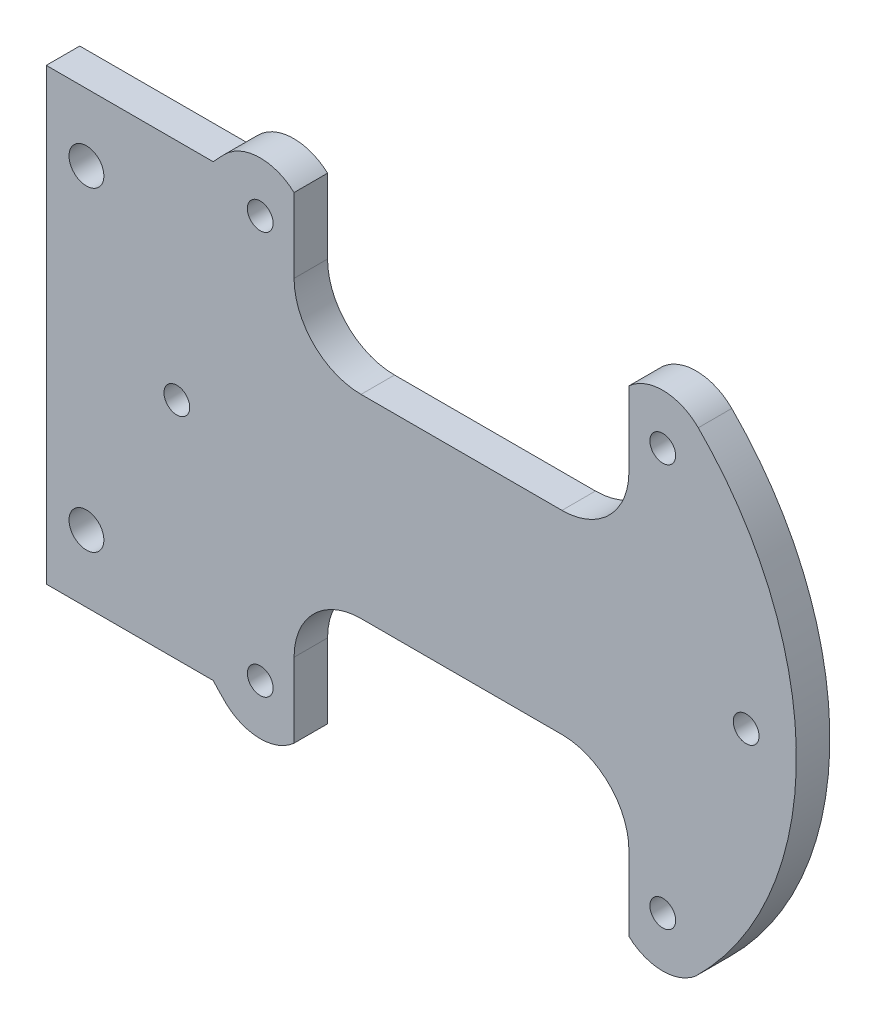
ISO-10303-21;
HEADER;
FILE_DESCRIPTION(('STEP AP214'),'2;1');
FILE_NAME('part.step','',(''),(''),'','','');
FILE_SCHEMA(('AUTOMOTIVE_DESIGN { 1 0 10303 214 1 1 1 1 }'));
ENDSEC;
DATA;
#1=APPLICATION_CONTEXT('core data for automotive mechanical design processes');
#2=APPLICATION_PROTOCOL_DEFINITION('international standard','automotive_design',2000,#1);
#3=PRODUCT_CONTEXT('',#1,'mechanical');
#4=PRODUCT('Part','Part','',(#3));
#5=PRODUCT_RELATED_PRODUCT_CATEGORY('part','',(#4));
#6=PRODUCT_DEFINITION_FORMATION('','',#4);
#7=PRODUCT_DEFINITION_CONTEXT('part definition',#1,'design');
#8=PRODUCT_DEFINITION('design','',#6,#7);
#9=PRODUCT_DEFINITION_SHAPE('','',#8);
#10=(LENGTH_UNIT() NAMED_UNIT(*) SI_UNIT(.MILLI.,.METRE.));
#11=(NAMED_UNIT(*) PLANE_ANGLE_UNIT() SI_UNIT($,.RADIAN.));
#12=(NAMED_UNIT(*) SI_UNIT($,.STERADIAN.) SOLID_ANGLE_UNIT());
#13=UNCERTAINTY_MEASURE_WITH_UNIT(LENGTH_MEASURE(1.E-05),#10,'distance_accuracy_value','');
#14=(GEOMETRIC_REPRESENTATION_CONTEXT(3) GLOBAL_UNCERTAINTY_ASSIGNED_CONTEXT((#13)) GLOBAL_UNIT_ASSIGNED_CONTEXT((#10,
#11,#12)) REPRESENTATION_CONTEXT('',''));
#15=CARTESIAN_POINT('',(0.,0.,0.));
#16=DIRECTION('',(0.,0.,1.));
#17=DIRECTION('',(1.,0.,0.));
#18=AXIS2_PLACEMENT_3D('',#15,#16,#17);
#19=CARTESIAN_POINT('',(0.,0.,-5.));
#20=DIRECTION('',(0.,0.,-1.));
#21=DIRECTION('',(1.,0.,0.));
#22=AXIS2_PLACEMENT_3D('',#19,#20,#21);
#23=PLANE('',#22);
#24=DIRECTION('',(-1.,0.,0.));
#25=VECTOR('',#24,1.);
#26=CARTESIAN_POINT('',(31.1783249397534,-14.7623848374618,-5.));
#27=LINE('',#26,#25);
#28=CARTESIAN_POINT('',(21.1783249397534,-14.7623848374618,-5.));
#29=VERTEX_POINT('',#28);
#30=CARTESIAN_POINT('',(-8.82167506024662,-14.7623848374618,-5.));
#31=VERTEX_POINT('',#30);
#32=EDGE_CURVE('E391',#29,#31,#27,.T.);
#33=ORIENTED_EDGE('',*,*,#32,.T.);
#34=CARTESIAN_POINT('',(-8.82167506024662,-24.7623848374618,-5.));
#35=DIRECTION('',(0.,0.,1.));
#36=DIRECTION('',(1.,0.,0.));
#37=AXIS2_PLACEMENT_3D('',#34,#35,#36);
#38=CIRCLE('',#37,10.);
#39=CARTESIAN_POINT('',(-18.8216750602466,-24.7623848374618,-5.));
#40=VERTEX_POINT('',#39);
#41=EDGE_CURVE('E400',#40,#31,#38,.F.);
#42=ORIENTED_EDGE('',*,*,#41,.F.);
#43=DIRECTION('',(0.,-1.,0.));
#44=VECTOR('',#43,1.);
#45=CARTESIAN_POINT('',(-18.8216750602466,0.,-5.));
#46=LINE('',#45,#44);
#47=CARTESIAN_POINT('',(-18.8216750602466,-35.8766663826548,-5.));
#48=VERTEX_POINT('',#47);
#49=EDGE_CURVE('E310',#40,#48,#46,.T.);
#50=ORIENTED_EDGE('',*,*,#49,.T.);
#51=CARTESIAN_POINT('',(-23.8737132606749,-30.3195256100583,-5.));
#52=DIRECTION('',(0.,0.,1.));
#53=DIRECTION('',(1.,0.,0.));
#54=AXIS2_PLACEMENT_3D('',#51,#52,#53);
#55=CIRCLE('',#54,7.51031980311364);
#56=CARTESIAN_POINT('',(-28.8738677906914,-35.9233955426134,-5.));
#57=VERTEX_POINT('',#56);
#58=EDGE_CURVE('E328',#57,#48,#55,.T.);
#59=ORIENTED_EDGE('',*,*,#58,.F.);
#60=CARTESIAN_POINT('',(6.17832493975339,-0.267487409630021,-5.));
#61=DIRECTION('',(0.,0.,1.));
#62=DIRECTION('',(1.,0.,0.));
#63=AXIS2_PLACEMENT_3D('',#60,#61,#62);
#64=CIRCLE('',#63,50.);
#65=CARTESIAN_POINT('',(-30.9026674957249,-33.8085070721269,-5.));
#66=VERTEX_POINT('',#65);
#67=EDGE_CURVE('E192',#66,#57,#64,.T.);
#68=ORIENTED_EDGE('',*,*,#67,.F.);
#69=DIRECTION('',(-1.,0.,0.));
#70=VECTOR('',#69,1.);
#71=CARTESIAN_POINT('',(0.,-33.8085070721269,-5.));
#72=LINE('',#71,#70);
#73=CARTESIAN_POINT('',(-55.8216750602466,-33.8085070721269,-5.));
#74=VERTEX_POINT('',#73);
#75=EDGE_CURVE('E257',#66,#74,#72,.T.);
#76=ORIENTED_EDGE('',*,*,#75,.T.);
#77=DIRECTION('',(0.,1.,0.));
#78=VECTOR('',#77,1.);
#79=CARTESIAN_POINT('',(-55.8216750602466,0.,-5.));
#80=LINE('',#79,#78);
#81=CARTESIAN_POINT('',(-55.8216750602466,33.2735322528668,-5.));
#82=VERTEX_POINT('',#81);
#83=EDGE_CURVE('E245',#74,#82,#80,.T.);
#84=ORIENTED_EDGE('',*,*,#83,.T.);
#85=DIRECTION('',(-1.,0.,0.));
#86=VECTOR('',#85,1.);
#87=CARTESIAN_POINT('',(0.,33.2735322528668,-5.));
#88=LINE('',#87,#86);
#89=CARTESIAN_POINT('',(-30.9026674957249,33.2735322528668,-5.));
#90=VERTEX_POINT('',#89);
#91=EDGE_CURVE('E249',#90,#82,#88,.T.);
#92=ORIENTED_EDGE('',*,*,#91,.F.);
#93=CARTESIAN_POINT('',(-29.177014119574,35.0878516496974,-5.));
#94=VERTEX_POINT('',#93);
#95=EDGE_CURVE('E256',#94,#90,#64,.T.);
#96=ORIENTED_EDGE('',*,*,#95,.F.);
#97=CARTESIAN_POINT('',(-23.8737132606749,29.7845507907983,-5.));
#98=DIRECTION('',(0.,0.,1.));
#99=DIRECTION('',(1.,0.,0.));
#100=AXIS2_PLACEMENT_3D('',#97,#98,#99);
#101=CIRCLE('',#100,7.50000000000002);
#102=CARTESIAN_POINT('',(-18.8216750602466,35.3277366997692,-5.));
#103=VERTEX_POINT('',#102);
#104=EDGE_CURVE('E339',#103,#94,#101,.T.);
#105=ORIENTED_EDGE('',*,*,#104,.F.);
#106=DIRECTION('',(0.,1.,0.));
#107=VECTOR('',#106,1.);
#108=CARTESIAN_POINT('',(-18.8216750602466,0.,-5.));
#109=LINE('',#108,#107);
#110=CARTESIAN_POINT('',(-18.8216750602466,24.2274100182018,-5.));
#111=VERTEX_POINT('',#110);
#112=EDGE_CURVE('E325',#111,#103,#109,.T.);
#113=ORIENTED_EDGE('',*,*,#112,.F.);
#114=CARTESIAN_POINT('',(-8.82167506024662,24.2274100182018,-5.));
#115=DIRECTION('',(0.,0.,1.));
#116=DIRECTION('',(1.,0.,0.));
#117=AXIS2_PLACEMENT_3D('',#114,#115,#116);
#118=CIRCLE('',#117,10.);
#119=CARTESIAN_POINT('',(-8.82167506024662,14.2274100182018,-5.));
#120=VERTEX_POINT('',#119);
#121=EDGE_CURVE('E58',#120,#111,#118,.F.);
#122=ORIENTED_EDGE('',*,*,#121,.F.);
#123=DIRECTION('',(1.,0.,0.));
#124=VECTOR('',#123,1.);
#125=CARTESIAN_POINT('',(-18.8216750602466,14.2274100182018,-5.));
#126=LINE('',#125,#124);
#127=CARTESIAN_POINT('',(21.1783249397534,14.2274100182018,-5.));
#128=VERTEX_POINT('',#127);
#129=EDGE_CURVE('E383',#120,#128,#126,.T.);
#130=ORIENTED_EDGE('',*,*,#129,.T.);
#131=CARTESIAN_POINT('',(21.1783249397534,24.2274100182018,-5.));
#132=DIRECTION('',(0.,0.,1.));
#133=DIRECTION('',(1.,0.,0.));
#134=AXIS2_PLACEMENT_3D('',#131,#132,#133);
#135=CIRCLE('',#134,10.);
#136=CARTESIAN_POINT('',(31.1783249397534,24.2274100182018,-5.));
#137=VERTEX_POINT('',#136);
#138=EDGE_CURVE('E424',#137,#128,#135,.F.);
#139=ORIENTED_EDGE('',*,*,#138,.F.);
#140=DIRECTION('',(0.,1.,0.));
#141=VECTOR('',#140,1.);
#142=CARTESIAN_POINT('',(31.1783249397534,0.,-5.));
#143=LINE('',#142,#141);
#144=CARTESIAN_POINT('',(31.1783249397534,35.3277366997692,-5.));
#145=VERTEX_POINT('',#144);
#146=EDGE_CURVE('E321',#137,#145,#143,.T.);
#147=ORIENTED_EDGE('',*,*,#146,.T.);
#148=CARTESIAN_POINT('',(36.2303631401817,29.7845507907982,-5.));
#149=DIRECTION('',(0.,0.,1.));
#150=DIRECTION('',(1.,0.,0.));
#151=AXIS2_PLACEMENT_3D('',#148,#149,#150);
#152=CIRCLE('',#151,7.50000000000001);
#153=CARTESIAN_POINT('',(41.5336639990808,35.0878516496974,-5.));
#154=VERTEX_POINT('',#153);
#155=EDGE_CURVE('E335',#154,#145,#152,.T.);
#156=ORIENTED_EDGE('',*,*,#155,.F.);
#157=CARTESIAN_POINT('',(41.2305176701982,-35.9233955426134,-5.));
#158=VERTEX_POINT('',#157);
#159=EDGE_CURVE('E255',#158,#154,#64,.T.);
#160=ORIENTED_EDGE('',*,*,#159,.F.);
#161=CARTESIAN_POINT('',(36.2303631401817,-30.3195256100583,-5.));
#162=DIRECTION('',(0.,0.,1.));
#163=DIRECTION('',(1.,0.,0.));
#164=AXIS2_PLACEMENT_3D('',#161,#162,#163);
#165=CIRCLE('',#164,7.51031980311364);
#166=CARTESIAN_POINT('',(31.1783249397534,-35.8766663826548,-5.));
#167=VERTEX_POINT('',#166);
#168=EDGE_CURVE('E331',#167,#158,#165,.T.);
#169=ORIENTED_EDGE('',*,*,#168,.F.);
#170=DIRECTION('',(0.,-1.,0.));
#171=VECTOR('',#170,1.);
#172=CARTESIAN_POINT('',(31.1783249397534,0.,-5.));
#173=LINE('',#172,#171);
#174=CARTESIAN_POINT('',(31.1783249397534,-24.7623848374618,-5.));
#175=VERTEX_POINT('',#174);
#176=EDGE_CURVE('E317',#175,#167,#173,.T.);
#177=ORIENTED_EDGE('',*,*,#176,.F.);
#178=CARTESIAN_POINT('',(21.1783249397534,-24.7623848374618,-5.));
#179=DIRECTION('',(0.,0.,1.));
#180=DIRECTION('',(1.,0.,0.));
#181=AXIS2_PLACEMENT_3D('',#178,#179,#180);
#182=CIRCLE('',#181,10.);
#183=EDGE_CURVE('E403',#29,#175,#182,.F.);
#184=ORIENTED_EDGE('',*,*,#183,.F.);
#185=EDGE_LOOP('',(#33,#42,#50,#59,#68,#76,#84,#92,#96,#105,#113,#122,#130,#139,#147,#156,#160,
#169,#177,#184));
#186=FACE_BOUND('',#185,.T.);
#187=CARTESIAN_POINT('',(-36.3216750602466,-0.267487409630021,-5.));
#188=DIRECTION('',(0.,0.,1.));
#189=DIRECTION('',(1.,0.,0.));
#190=AXIS2_PLACEMENT_3D('',#187,#188,#189);
#191=CIRCLE('',#190,1.925);
#192=CARTESIAN_POINT('',(-34.3966750602466,-0.267487409630021,-5.));
#193=VERTEX_POINT('',#192);
#194=EDGE_CURVE('E264',#193,#193,#191,.T.);
#195=ORIENTED_EDGE('',*,*,#194,.T.);
#196=EDGE_LOOP('',(#195));
#197=FACE_BOUND('',#196,.T.);
#198=CARTESIAN_POINT('',(-23.8737132606749,-30.3195256100583,-5.));
#199=DIRECTION('',(0.,0.,1.));
#200=DIRECTION('',(1.,0.,0.));
#201=AXIS2_PLACEMENT_3D('',#198,#199,#200);
#202=CIRCLE('',#201,1.925);
#203=CARTESIAN_POINT('',(-21.9487132606749,-30.3195256100583,-5.));
#204=VERTEX_POINT('',#203);
#205=EDGE_CURVE('E269',#204,#204,#202,.T.);
#206=ORIENTED_EDGE('',*,*,#205,.T.);
#207=EDGE_LOOP('',(#206));
#208=FACE_BOUND('',#207,.T.);
#209=CARTESIAN_POINT('',(36.2303631401817,-30.3195256100583,-5.));
#210=DIRECTION('',(0.,0.,1.));
#211=DIRECTION('',(1.,0.,0.));
#212=AXIS2_PLACEMENT_3D('',#209,#210,#211);
#213=CIRCLE('',#212,1.925);
#214=CARTESIAN_POINT('',(38.1553631401817,-30.3195256100583,-5.));
#215=VERTEX_POINT('',#214);
#216=EDGE_CURVE('E273',#215,#215,#213,.T.);
#217=ORIENTED_EDGE('',*,*,#216,.T.);
#218=EDGE_LOOP('',(#217));
#219=FACE_BOUND('',#218,.T.);
#220=CARTESIAN_POINT('',(48.6783249397534,-0.267487409630026,-5.));
#221=DIRECTION('',(0.,0.,1.));
#222=DIRECTION('',(1.,0.,0.));
#223=AXIS2_PLACEMENT_3D('',#220,#221,#222);
#224=CIRCLE('',#223,1.925);
#225=CARTESIAN_POINT('',(50.6033249397534,-0.267487409630026,-5.));
#226=VERTEX_POINT('',#225);
#227=EDGE_CURVE('E277',#226,#226,#224,.T.);
#228=ORIENTED_EDGE('',*,*,#227,.T.);
#229=EDGE_LOOP('',(#228));
#230=FACE_BOUND('',#229,.T.);
#231=CARTESIAN_POINT('',(36.2303631401817,29.7845507907982,-5.));
#232=DIRECTION('',(0.,0.,1.));
#233=DIRECTION('',(1.,0.,0.));
#234=AXIS2_PLACEMENT_3D('',#231,#232,#233);
#235=CIRCLE('',#234,1.925);
#236=CARTESIAN_POINT('',(38.1553631401817,29.7845507907982,-5.));
#237=VERTEX_POINT('',#236);
#238=EDGE_CURVE('E281',#237,#237,#235,.T.);
#239=ORIENTED_EDGE('',*,*,#238,.T.);
#240=EDGE_LOOP('',(#239));
#241=FACE_BOUND('',#240,.T.);
#242=CARTESIAN_POINT('',(-23.8737132606749,29.7845507907983,-5.));
#243=DIRECTION('',(0.,0.,1.));
#244=DIRECTION('',(1.,0.,0.));
#245=AXIS2_PLACEMENT_3D('',#242,#243,#244);
#246=CIRCLE('',#245,1.925);
#247=CARTESIAN_POINT('',(-21.9487132606749,29.7845507907983,-5.));
#248=VERTEX_POINT('',#247);
#249=EDGE_CURVE('E285',#248,#248,#246,.T.);
#250=ORIENTED_EDGE('',*,*,#249,.T.);
#251=EDGE_LOOP('',(#250));
#252=FACE_BOUND('',#251,.T.);
#253=CARTESIAN_POINT('',(-49.8216750602466,-23.8085070721269,-5.));
#254=DIRECTION('',(0.,0.,1.));
#255=DIRECTION('',(1.,0.,0.));
#256=AXIS2_PLACEMENT_3D('',#253,#254,#255);
#257=CIRCLE('',#256,2.6);
#258=CARTESIAN_POINT('',(-47.2216750602466,-23.8085070721269,-5.));
#259=VERTEX_POINT('',#258);
#260=EDGE_CURVE('E240',#259,#259,#257,.T.);
#261=ORIENTED_EDGE('',*,*,#260,.T.);
#262=EDGE_LOOP('',(#261));
#263=FACE_BOUND('',#262,.T.);
#264=CARTESIAN_POINT('',(-49.8216750602466,23.2735322528668,-5.));
#265=DIRECTION('',(0.,0.,1.));
#266=DIRECTION('',(1.,0.,0.));
#267=AXIS2_PLACEMENT_3D('',#264,#265,#266);
#268=CIRCLE('',#267,2.6);
#269=CARTESIAN_POINT('',(-47.2216750602466,23.2735322528668,-5.));
#270=VERTEX_POINT('',#269);
#271=EDGE_CURVE('E233',#270,#270,#268,.T.);
#272=ORIENTED_EDGE('',*,*,#271,.T.);
#273=EDGE_LOOP('',(#272));
#274=FACE_BOUND('',#273,.T.);
#275=ADVANCED_FACE('F49',(#186,#197,#208,#219,#230,#241,#252,#263,#274),#23,.T.);
#276=CARTESIAN_POINT('',(0.,0.,0.));
#277=DIRECTION('',(0.,0.,-1.));
#278=DIRECTION('',(1.,0.,0.));
#279=AXIS2_PLACEMENT_3D('',#276,#277,#278);
#280=PLANE('',#279);
#281=DIRECTION('',(0.,1.,0.));
#282=VECTOR('',#281,1.);
#283=CARTESIAN_POINT('',(31.1783249397534,-43.568757598852,0.));
#284=LINE('',#283,#282);
#285=CARTESIAN_POINT('',(31.1783249397534,-35.8766663826548,0.));
#286=VERTEX_POINT('',#285);
#287=CARTESIAN_POINT('',(31.1783249397534,-24.7623848374618,0.));
#288=VERTEX_POINT('',#287);
#289=EDGE_CURVE('E357',#286,#288,#284,.T.);
#290=ORIENTED_EDGE('',*,*,#289,.F.);
#291=CARTESIAN_POINT('',(36.2303631401817,-30.3195256100583,0.));
#292=DIRECTION('',(0.,0.,-1.));
#293=DIRECTION('',(-1.,0.,0.));
#294=AXIS2_PLACEMENT_3D('',#291,#292,#293);
#295=CIRCLE('',#294,7.51031980311364);
#296=CARTESIAN_POINT('',(41.2305176701982,-35.9233955426134,0.));
#297=VERTEX_POINT('',#296);
#298=EDGE_CURVE('E208',#297,#286,#295,.T.);
#299=ORIENTED_EDGE('',*,*,#298,.F.);
#300=CARTESIAN_POINT('',(6.17832493975339,-0.267487409630021,0.));
#301=DIRECTION('',(0.,0.,1.));
#302=DIRECTION('',(1.,0.,0.));
#303=AXIS2_PLACEMENT_3D('',#300,#301,#302);
#304=CIRCLE('',#303,50.);
#305=CARTESIAN_POINT('',(41.5336639990808,35.0878516496974,0.));
#306=VERTEX_POINT('',#305);
#307=EDGE_CURVE('E218',#297,#306,#304,.T.);
#308=ORIENTED_EDGE('',*,*,#307,.T.);
#309=CARTESIAN_POINT('',(36.2303631401817,29.7845507907982,0.));
#310=DIRECTION('',(0.,0.,-1.));
#311=DIRECTION('',(-1.,0.,0.));
#312=AXIS2_PLACEMENT_3D('',#309,#310,#311);
#313=CIRCLE('',#312,7.50000000000001);
#314=CARTESIAN_POINT('',(31.1783249397534,35.3277366997692,0.));
#315=VERTEX_POINT('',#314);
#316=EDGE_CURVE('E349',#315,#306,#313,.T.);
#317=ORIENTED_EDGE('',*,*,#316,.F.);
#318=DIRECTION('',(0.,-1.,0.));
#319=VECTOR('',#318,1.);
#320=CARTESIAN_POINT('',(31.1783249397534,43.0337827795919,0.));
#321=LINE('',#320,#319);
#322=CARTESIAN_POINT('',(31.1783249397534,24.2274100182018,0.));
#323=VERTEX_POINT('',#322);
#324=EDGE_CURVE('E348',#315,#323,#321,.T.);
#325=ORIENTED_EDGE('',*,*,#324,.T.);
#326=CARTESIAN_POINT('',(21.1783249397534,24.2274100182018,0.));
#327=DIRECTION('',(0.,0.,1.));
#328=DIRECTION('',(1.,0.,0.));
#329=AXIS2_PLACEMENT_3D('',#326,#327,#328);
#330=CIRCLE('',#329,10.);
#331=CARTESIAN_POINT('',(21.1783249397534,14.2274100182018,0.));
#332=VERTEX_POINT('',#331);
#333=EDGE_CURVE('E418',#332,#323,#330,.T.);
#334=ORIENTED_EDGE('',*,*,#333,.F.);
#335=DIRECTION('',(-1.,0.,0.));
#336=VECTOR('',#335,1.);
#337=CARTESIAN_POINT('',(31.1783249397534,14.2274100182018,0.));
#338=LINE('',#337,#336);
#339=CARTESIAN_POINT('',(-8.82167506024662,14.2274100182018,0.));
#340=VERTEX_POINT('',#339);
#341=EDGE_CURVE('E364',#332,#340,#338,.T.);
#342=ORIENTED_EDGE('',*,*,#341,.T.);
#343=CARTESIAN_POINT('',(-8.82167506024662,24.2274100182018,0.));
#344=DIRECTION('',(0.,0.,1.));
#345=DIRECTION('',(1.,0.,0.));
#346=AXIS2_PLACEMENT_3D('',#343,#344,#345);
#347=CIRCLE('',#346,10.);
#348=CARTESIAN_POINT('',(-18.8216750602466,24.2274100182018,0.));
#349=VERTEX_POINT('',#348);
#350=EDGE_CURVE('E11',#349,#340,#347,.T.);
#351=ORIENTED_EDGE('',*,*,#350,.F.);
#352=DIRECTION('',(0.,-1.,0.));
#353=VECTOR('',#352,1.);
#354=CARTESIAN_POINT('',(-18.8216750602466,43.0337827795919,0.));
#355=LINE('',#354,#353);
#356=CARTESIAN_POINT('',(-18.8216750602466,35.3277366997692,0.));
#357=VERTEX_POINT('',#356);
#358=EDGE_CURVE('E354',#357,#349,#355,.T.);
#359=ORIENTED_EDGE('',*,*,#358,.F.);
#360=CARTESIAN_POINT('',(-23.8737132606749,29.7845507907983,0.));
#361=DIRECTION('',(0.,0.,-1.));
#362=DIRECTION('',(-1.,0.,0.));
#363=AXIS2_PLACEMENT_3D('',#360,#361,#362);
#364=CIRCLE('',#363,7.50000000000002);
#365=CARTESIAN_POINT('',(-29.177014119574,35.0878516496974,0.));
#366=VERTEX_POINT('',#365);
#367=EDGE_CURVE('E344',#366,#357,#364,.T.);
#368=ORIENTED_EDGE('',*,*,#367,.F.);
#369=CARTESIAN_POINT('',(-30.9026674957249,33.2735322528668,0.));
#370=VERTEX_POINT('',#369);
#371=EDGE_CURVE('E220',#366,#370,#304,.T.);
#372=ORIENTED_EDGE('',*,*,#371,.T.);
#373=DIRECTION('',(-1.,0.,0.));
#374=VECTOR('',#373,1.);
#375=CARTESIAN_POINT('',(0.,33.2735322528668,0.));
#376=LINE('',#375,#374);
#377=CARTESIAN_POINT('',(-55.8216750602466,33.2735322528668,0.));
#378=VERTEX_POINT('',#377);
#379=EDGE_CURVE('E217',#370,#378,#376,.T.);
#380=ORIENTED_EDGE('',*,*,#379,.T.);
#381=DIRECTION('',(0.,1.,0.));
#382=VECTOR('',#381,1.);
#383=CARTESIAN_POINT('',(-55.8216750602466,0.,0.));
#384=LINE('',#383,#382);
#385=CARTESIAN_POINT('',(-55.8216750602466,-33.8085070721269,0.));
#386=VERTEX_POINT('',#385);
#387=EDGE_CURVE('E224',#386,#378,#384,.T.);
#388=ORIENTED_EDGE('',*,*,#387,.F.);
#389=DIRECTION('',(-1.,0.,0.));
#390=VECTOR('',#389,1.);
#391=CARTESIAN_POINT('',(0.,-33.8085070721269,0.));
#392=LINE('',#391,#390);
#393=CARTESIAN_POINT('',(-30.9026674957249,-33.8085070721269,0.));
#394=VERTEX_POINT('',#393);
#395=EDGE_CURVE('E215',#394,#386,#392,.T.);
#396=ORIENTED_EDGE('',*,*,#395,.F.);
#397=CARTESIAN_POINT('',(-28.8738677906914,-35.9233955426134,0.));
#398=VERTEX_POINT('',#397);
#399=EDGE_CURVE('E189',#394,#398,#304,.T.);
#400=ORIENTED_EDGE('',*,*,#399,.T.);
#401=CARTESIAN_POINT('',(-23.8737132606749,-30.3195256100583,0.));
#402=DIRECTION('',(0.,0.,-1.));
#403=DIRECTION('',(-1.,0.,0.));
#404=AXIS2_PLACEMENT_3D('',#401,#402,#403);
#405=CIRCLE('',#404,7.51031980311364);
#406=CARTESIAN_POINT('',(-18.8216750602466,-35.8766663826548,0.));
#407=VERTEX_POINT('',#406);
#408=EDGE_CURVE('E201',#407,#398,#405,.T.);
#409=ORIENTED_EDGE('',*,*,#408,.F.);
#410=DIRECTION('',(0.,1.,0.));
#411=VECTOR('',#410,1.);
#412=CARTESIAN_POINT('',(-18.8216750602466,-43.568757598852,0.));
#413=LINE('',#412,#411);
#414=CARTESIAN_POINT('',(-18.8216750602466,-24.7623848374618,0.));
#415=VERTEX_POINT('',#414);
#416=EDGE_CURVE('E371',#407,#415,#413,.T.);
#417=ORIENTED_EDGE('',*,*,#416,.T.);
#418=CARTESIAN_POINT('',(-8.82167506024662,-24.7623848374618,0.));
#419=DIRECTION('',(0.,0.,1.));
#420=DIRECTION('',(1.,0.,0.));
#421=AXIS2_PLACEMENT_3D('',#418,#419,#420);
#422=CIRCLE('',#421,10.);
#423=CARTESIAN_POINT('',(-8.82167506024662,-14.7623848374618,0.));
#424=VERTEX_POINT('',#423);
#425=EDGE_CURVE('E419',#424,#415,#422,.T.);
#426=ORIENTED_EDGE('',*,*,#425,.F.);
#427=DIRECTION('',(1.,0.,0.));
#428=VECTOR('',#427,1.);
#429=CARTESIAN_POINT('',(-18.8216750602466,-14.7623848374618,0.));
#430=LINE('',#429,#428);
#431=CARTESIAN_POINT('',(21.1783249397534,-14.7623848374618,0.));
#432=VERTEX_POINT('',#431);
#433=EDGE_CURVE('E387',#424,#432,#430,.T.);
#434=ORIENTED_EDGE('',*,*,#433,.T.);
#435=CARTESIAN_POINT('',(21.1783249397534,-24.7623848374618,0.));
#436=DIRECTION('',(0.,0.,1.));
#437=DIRECTION('',(1.,0.,0.));
#438=AXIS2_PLACEMENT_3D('',#435,#436,#437);
#439=CIRCLE('',#438,10.);
#440=EDGE_CURVE('E426',#288,#432,#439,.T.);
#441=ORIENTED_EDGE('',*,*,#440,.F.);
#442=EDGE_LOOP('',(#290,#299,#308,#317,#325,#334,#342,#351,#359,#368,#372,#380,#388,#396,#400,
#409,#417,#426,#434,#441));
#443=FACE_BOUND('',#442,.T.);
#444=CARTESIAN_POINT('',(-36.3216750602466,-0.267487409630021,0.));
#445=DIRECTION('',(0.,0.,-1.));
#446=DIRECTION('',(-1.,0.,0.));
#447=AXIS2_PLACEMENT_3D('',#444,#445,#446);
#448=CIRCLE('',#447,1.925);
#449=CARTESIAN_POINT('',(-38.2466750602466,-0.267487409630021,0.));
#450=VERTEX_POINT('',#449);
#451=EDGE_CURVE('E293',#450,#450,#448,.T.);
#452=ORIENTED_EDGE('',*,*,#451,.T.);
#453=EDGE_LOOP('',(#452));
#454=FACE_BOUND('',#453,.T.);
#455=CARTESIAN_POINT('',(-23.8737132606749,-30.3195256100583,0.));
#456=DIRECTION('',(0.,0.,-1.));
#457=DIRECTION('',(-1.,0.,0.));
#458=AXIS2_PLACEMENT_3D('',#455,#456,#457);
#459=CIRCLE('',#458,1.925);
#460=CARTESIAN_POINT('',(-25.7987132606749,-30.3195256100583,0.));
#461=VERTEX_POINT('',#460);
#462=EDGE_CURVE('E298',#461,#461,#459,.T.);
#463=ORIENTED_EDGE('',*,*,#462,.T.);
#464=EDGE_LOOP('',(#463));
#465=FACE_BOUND('',#464,.T.);
#466=CARTESIAN_POINT('',(36.2303631401817,-30.3195256100583,0.));
#467=DIRECTION('',(0.,0.,-1.));
#468=DIRECTION('',(-1.,0.,0.));
#469=AXIS2_PLACEMENT_3D('',#466,#467,#468);
#470=CIRCLE('',#469,1.925);
#471=CARTESIAN_POINT('',(34.3053631401817,-30.3195256100583,0.));
#472=VERTEX_POINT('',#471);
#473=EDGE_CURVE('E294',#472,#472,#470,.T.);
#474=ORIENTED_EDGE('',*,*,#473,.T.);
#475=EDGE_LOOP('',(#474));
#476=FACE_BOUND('',#475,.T.);
#477=CARTESIAN_POINT('',(48.6783249397534,-0.267487409630026,0.));
#478=DIRECTION('',(0.,0.,-1.));
#479=DIRECTION('',(-1.,0.,0.));
#480=AXIS2_PLACEMENT_3D('',#477,#478,#479);
#481=CIRCLE('',#480,1.925);
#482=CARTESIAN_POINT('',(46.7533249397534,-0.267487409630026,0.));
#483=VERTEX_POINT('',#482);
#484=EDGE_CURVE('E299',#483,#483,#481,.T.);
#485=ORIENTED_EDGE('',*,*,#484,.T.);
#486=EDGE_LOOP('',(#485));
#487=FACE_BOUND('',#486,.T.);
#488=CARTESIAN_POINT('',(36.2303631401817,29.7845507907982,0.));
#489=DIRECTION('',(0.,0.,-1.));
#490=DIRECTION('',(-1.,0.,0.));
#491=AXIS2_PLACEMENT_3D('',#488,#489,#490);
#492=CIRCLE('',#491,1.925);
#493=CARTESIAN_POINT('',(34.3053631401817,29.7845507907982,0.));
#494=VERTEX_POINT('',#493);
#495=EDGE_CURVE('E306',#494,#494,#492,.T.);
#496=ORIENTED_EDGE('',*,*,#495,.T.);
#497=EDGE_LOOP('',(#496));
#498=FACE_BOUND('',#497,.T.);
#499=CARTESIAN_POINT('',(-23.8737132606749,29.7845507907983,0.));
#500=DIRECTION('',(0.,0.,-1.));
#501=DIRECTION('',(-1.,0.,0.));
#502=AXIS2_PLACEMENT_3D('',#499,#500,#501);
#503=CIRCLE('',#502,1.925);
#504=CARTESIAN_POINT('',(-25.7987132606749,29.7845507907983,0.));
#505=VERTEX_POINT('',#504);
#506=EDGE_CURVE('E289',#505,#505,#503,.T.);
#507=ORIENTED_EDGE('',*,*,#506,.T.);
#508=EDGE_LOOP('',(#507));
#509=FACE_BOUND('',#508,.T.);
#510=CARTESIAN_POINT('',(-49.8216750602466,-23.8085070721269,0.));
#511=DIRECTION('',(0.,0.,1.));
#512=DIRECTION('',(1.,0.,0.));
#513=AXIS2_PLACEMENT_3D('',#510,#511,#512);
#514=CIRCLE('',#513,2.6);
#515=CARTESIAN_POINT('',(-47.2216750602466,-23.8085070721269,0.));
#516=VERTEX_POINT('',#515);
#517=EDGE_CURVE('E261',#516,#516,#514,.T.);
#518=ORIENTED_EDGE('',*,*,#517,.F.);
#519=EDGE_LOOP('',(#518));
#520=FACE_BOUND('',#519,.T.);
#521=CARTESIAN_POINT('',(-49.8216750602466,23.2735322528668,0.));
#522=DIRECTION('',(0.,0.,1.));
#523=DIRECTION('',(1.,0.,0.));
#524=AXIS2_PLACEMENT_3D('',#521,#522,#523);
#525=CIRCLE('',#524,2.6);
#526=CARTESIAN_POINT('',(-47.2216750602466,23.2735322528668,0.));
#527=VERTEX_POINT('',#526);
#528=EDGE_CURVE('E237',#527,#527,#525,.T.);
#529=ORIENTED_EDGE('',*,*,#528,.F.);
#530=EDGE_LOOP('',(#529));
#531=FACE_BOUND('',#530,.T.);
#532=ADVANCED_FACE('F211',(#443,#454,#465,#476,#487,#498,#509,#520,#531),#280,.F.);
#533=CARTESIAN_POINT('',(6.17832493975339,-0.267487409630021,-5.));
#534=DIRECTION('',(0.,0.,1.));
#535=DIRECTION('',(-1.,0.,0.));
#536=AXIS2_PLACEMENT_3D('',#533,#534,#535);
#537=CYLINDRICAL_SURFACE('',#536,50.);
#538=DIRECTION('',(0.,0.,1.));
#539=VECTOR('',#538,1.);
#540=CARTESIAN_POINT('',(-28.8738677906914,-35.9233955426134,-5.));
#541=LINE('',#540,#539);
#542=EDGE_CURVE('E185',#57,#398,#541,.T.);
#543=ORIENTED_EDGE('',*,*,#542,.T.);
#544=ORIENTED_EDGE('',*,*,#399,.F.);
#545=DIRECTION('',(0.,0.,1.));
#546=VECTOR('',#545,1.);
#547=CARTESIAN_POINT('',(-30.9026674957249,-33.8085070721269,-5.));
#548=LINE('',#547,#546);
#549=EDGE_CURVE('E475',#66,#394,#548,.T.);
#550=ORIENTED_EDGE('',*,*,#549,.F.);
#551=ORIENTED_EDGE('',*,*,#67,.T.);
#552=EDGE_LOOP('',(#543,#544,#550,#551));
#553=FACE_BOUND('',#552,.T.);
#554=ADVANCED_FACE('F187',(#553),#537,.T.);
#555=DIRECTION('',(0.,0.,1.));
#556=VECTOR('',#555,1.);
#557=CARTESIAN_POINT('',(41.2305176701982,-35.9233955426134,-5.));
#558=LINE('',#557,#556);
#559=EDGE_CURVE('E198',#297,#158,#558,.F.);
#560=ORIENTED_EDGE('',*,*,#559,.T.);
#561=ORIENTED_EDGE('',*,*,#159,.T.);
#562=DIRECTION('',(0.,0.,1.));
#563=VECTOR('',#562,1.);
#564=CARTESIAN_POINT('',(41.5336639990808,35.0878516496974,-5.));
#565=LINE('',#564,#563);
#566=EDGE_CURVE('E498',#154,#306,#565,.T.);
#567=ORIENTED_EDGE('',*,*,#566,.T.);
#568=ORIENTED_EDGE('',*,*,#307,.F.);
#569=EDGE_LOOP('',(#560,#561,#567,#568));
#570=FACE_BOUND('',#569,.T.);
#571=ADVANCED_FACE('F496',(#570),#537,.T.);
#572=CARTESIAN_POINT('',(0.,-33.8085070721269,-5.));
#573=DIRECTION('',(0.,-1.,0.));
#574=DIRECTION('',(0.,0.,1.));
#575=AXIS2_PLACEMENT_3D('',#572,#573,#574);
#576=PLANE('',#575);
#577=ORIENTED_EDGE('',*,*,#395,.T.);
#578=DIRECTION('',(0.,0.,1.));
#579=VECTOR('',#578,1.);
#580=CARTESIAN_POINT('',(-55.8216750602466,-33.8085070721269,-5.));
#581=LINE('',#580,#579);
#582=EDGE_CURVE('E244',#74,#386,#581,.T.);
#583=ORIENTED_EDGE('',*,*,#582,.F.);
#584=ORIENTED_EDGE('',*,*,#75,.F.);
#585=ORIENTED_EDGE('',*,*,#549,.T.);
#586=EDGE_LOOP('',(#577,#583,#584,#585));
#587=FACE_BOUND('',#586,.T.);
#588=ADVANCED_FACE('F474',(#587),#576,.T.);
#589=ORIENTED_EDGE('',*,*,#95,.T.);
#590=DIRECTION('',(0.,0.,1.));
#591=VECTOR('',#590,1.);
#592=CARTESIAN_POINT('',(-30.9026674957249,33.2735322528668,-5.));
#593=LINE('',#592,#591);
#594=EDGE_CURVE('E485',#90,#370,#593,.T.);
#595=ORIENTED_EDGE('',*,*,#594,.T.);
#596=ORIENTED_EDGE('',*,*,#371,.F.);
#597=DIRECTION('',(0.,0.,1.));
#598=VECTOR('',#597,1.);
#599=CARTESIAN_POINT('',(-29.177014119574,35.0878516496974,-5.));
#600=LINE('',#599,#598);
#601=EDGE_CURVE('E444',#94,#366,#600,.T.);
#602=ORIENTED_EDGE('',*,*,#601,.F.);
#603=EDGE_LOOP('',(#589,#595,#596,#602));
#604=FACE_BOUND('',#603,.T.);
#605=ADVANCED_FACE('F557',(#604),#537,.T.);
#606=CARTESIAN_POINT('',(0.,33.2735322528668,-5.));
#607=DIRECTION('',(0.,-1.,0.));
#608=DIRECTION('',(0.,0.,1.));
#609=AXIS2_PLACEMENT_3D('',#606,#607,#608);
#610=PLANE('',#609);
#611=ORIENTED_EDGE('',*,*,#379,.F.);
#612=ORIENTED_EDGE('',*,*,#594,.F.);
#613=ORIENTED_EDGE('',*,*,#91,.T.);
#614=DIRECTION('',(0.,0.,1.));
#615=VECTOR('',#614,1.);
#616=CARTESIAN_POINT('',(-55.8216750602466,33.2735322528668,-5.));
#617=LINE('',#616,#615);
#618=EDGE_CURVE('E479',#82,#378,#617,.T.);
#619=ORIENTED_EDGE('',*,*,#618,.T.);
#620=EDGE_LOOP('',(#611,#612,#613,#619));
#621=FACE_BOUND('',#620,.T.);
#622=ADVANCED_FACE('F487',(#621),#610,.F.);
#623=CARTESIAN_POINT('',(-55.8216750602466,0.,-5.));
#624=DIRECTION('',(-1.,0.,0.));
#625=DIRECTION('',(0.,0.,-1.));
#626=AXIS2_PLACEMENT_3D('',#623,#624,#625);
#627=PLANE('',#626);
#628=ORIENTED_EDGE('',*,*,#387,.T.);
#629=ORIENTED_EDGE('',*,*,#618,.F.);
#630=ORIENTED_EDGE('',*,*,#83,.F.);
#631=ORIENTED_EDGE('',*,*,#582,.T.);
#632=EDGE_LOOP('',(#628,#629,#630,#631));
#633=FACE_BOUND('',#632,.T.);
#634=ADVANCED_FACE('F481',(#633),#627,.T.);
#635=CARTESIAN_POINT('',(-49.8216750602466,-23.8085070721269,-5.));
#636=DIRECTION('',(0.,0.,1.));
#637=DIRECTION('',(-1.,0.,0.));
#638=AXIS2_PLACEMENT_3D('',#635,#636,#637);
#639=CYLINDRICAL_SURFACE('',#638,2.6);
#640=ORIENTED_EDGE('',*,*,#260,.F.);
#641=EDGE_LOOP('',(#640));
#642=FACE_BOUND('',#641,.T.);
#643=ORIENTED_EDGE('',*,*,#517,.T.);
#644=EDGE_LOOP('',(#643));
#645=FACE_BOUND('',#644,.T.);
#646=ADVANCED_FACE('F526',(#642,#645),#639,.F.);
#647=CARTESIAN_POINT('',(-49.8216750602466,23.2735322528668,-5.));
#648=DIRECTION('',(0.,0.,1.));
#649=DIRECTION('',(-1.,0.,0.));
#650=AXIS2_PLACEMENT_3D('',#647,#648,#649);
#651=CYLINDRICAL_SURFACE('',#650,2.6);
#652=ORIENTED_EDGE('',*,*,#271,.F.);
#653=EDGE_LOOP('',(#652));
#654=FACE_BOUND('',#653,.T.);
#655=ORIENTED_EDGE('',*,*,#528,.T.);
#656=EDGE_LOOP('',(#655));
#657=FACE_BOUND('',#656,.T.);
#658=ADVANCED_FACE('F533',(#654,#657),#651,.F.);
#659=CARTESIAN_POINT('',(-23.8737132606749,29.7845507907983,-10.));
#660=DIRECTION('',(0.,0.,1.));
#661=DIRECTION('',(-1.,0.,0.));
#662=AXIS2_PLACEMENT_3D('',#659,#660,#661);
#663=CYLINDRICAL_SURFACE('',#662,1.925);
#664=ORIENTED_EDGE('',*,*,#249,.F.);
#665=EDGE_LOOP('',(#664));
#666=FACE_BOUND('',#665,.T.);
#667=ORIENTED_EDGE('',*,*,#506,.F.);
#668=EDGE_LOOP('',(#667));
#669=FACE_BOUND('',#668,.T.);
#670=ADVANCED_FACE('F535',(#666,#669),#663,.F.);
#671=CARTESIAN_POINT('',(36.2303631401817,29.7845507907982,-10.));
#672=DIRECTION('',(0.,0.,1.));
#673=DIRECTION('',(-1.,0.,0.));
#674=AXIS2_PLACEMENT_3D('',#671,#672,#673);
#675=CYLINDRICAL_SURFACE('',#674,1.925);
#676=ORIENTED_EDGE('',*,*,#238,.F.);
#677=EDGE_LOOP('',(#676));
#678=FACE_BOUND('',#677,.T.);
#679=ORIENTED_EDGE('',*,*,#495,.F.);
#680=EDGE_LOOP('',(#679));
#681=FACE_BOUND('',#680,.T.);
#682=ADVANCED_FACE('F542',(#678,#681),#675,.F.);
#683=CARTESIAN_POINT('',(48.6783249397534,-0.267487409630026,-10.));
#684=DIRECTION('',(0.,0.,1.));
#685=DIRECTION('',(-1.,0.,0.));
#686=AXIS2_PLACEMENT_3D('',#683,#684,#685);
#687=CYLINDRICAL_SURFACE('',#686,1.925);
#688=ORIENTED_EDGE('',*,*,#227,.F.);
#689=EDGE_LOOP('',(#688));
#690=FACE_BOUND('',#689,.T.);
#691=ORIENTED_EDGE('',*,*,#484,.F.);
#692=EDGE_LOOP('',(#691));
#693=FACE_BOUND('',#692,.T.);
#694=ADVANCED_FACE('F597',(#690,#693),#687,.F.);
#695=CARTESIAN_POINT('',(36.2303631401817,-30.3195256100583,-10.));
#696=DIRECTION('',(0.,0.,1.));
#697=DIRECTION('',(-1.,0.,0.));
#698=AXIS2_PLACEMENT_3D('',#695,#696,#697);
#699=CYLINDRICAL_SURFACE('',#698,1.925);
#700=ORIENTED_EDGE('',*,*,#216,.F.);
#701=EDGE_LOOP('',(#700));
#702=FACE_BOUND('',#701,.T.);
#703=ORIENTED_EDGE('',*,*,#473,.F.);
#704=EDGE_LOOP('',(#703));
#705=FACE_BOUND('',#704,.T.);
#706=ADVANCED_FACE('F600',(#702,#705),#699,.F.);
#707=CARTESIAN_POINT('',(-23.8737132606749,-30.3195256100583,-10.));
#708=DIRECTION('',(0.,0.,1.));
#709=DIRECTION('',(-1.,0.,0.));
#710=AXIS2_PLACEMENT_3D('',#707,#708,#709);
#711=CYLINDRICAL_SURFACE('',#710,1.925);
#712=ORIENTED_EDGE('',*,*,#205,.F.);
#713=EDGE_LOOP('',(#712));
#714=FACE_BOUND('',#713,.T.);
#715=ORIENTED_EDGE('',*,*,#462,.F.);
#716=EDGE_LOOP('',(#715));
#717=FACE_BOUND('',#716,.T.);
#718=ADVANCED_FACE('F607',(#714,#717),#711,.F.);
#719=CARTESIAN_POINT('',(-36.3216750602466,-0.267487409630021,-10.));
#720=DIRECTION('',(0.,0.,1.));
#721=DIRECTION('',(-1.,0.,0.));
#722=AXIS2_PLACEMENT_3D('',#719,#720,#721);
#723=CYLINDRICAL_SURFACE('',#722,1.925);
#724=ORIENTED_EDGE('',*,*,#194,.F.);
#725=EDGE_LOOP('',(#724));
#726=FACE_BOUND('',#725,.T.);
#727=ORIENTED_EDGE('',*,*,#451,.F.);
#728=EDGE_LOOP('',(#727));
#729=FACE_BOUND('',#728,.T.);
#730=ADVANCED_FACE('F596',(#726,#729),#723,.F.);
#731=CARTESIAN_POINT('',(36.2303631401817,29.7845507907982,-10.));
#732=DIRECTION('',(0.,0.,1.));
#733=DIRECTION('',(-1.,0.,0.));
#734=AXIS2_PLACEMENT_3D('',#731,#732,#733);
#735=CYLINDRICAL_SURFACE('',#734,7.50000000000001);
#736=ORIENTED_EDGE('',*,*,#566,.F.);
#737=ORIENTED_EDGE('',*,*,#155,.T.);
#738=DIRECTION('',(0.,0.,1.));
#739=VECTOR('',#738,1.);
#740=CARTESIAN_POINT('',(31.1783249397534,35.3277366997692,-10.));
#741=LINE('',#740,#739);
#742=EDGE_CURVE('E353',#145,#315,#741,.T.);
#743=ORIENTED_EDGE('',*,*,#742,.T.);
#744=ORIENTED_EDGE('',*,*,#316,.T.);
#745=EDGE_LOOP('',(#736,#737,#743,#744));
#746=FACE_BOUND('',#745,.T.);
#747=ADVANCED_FACE('F503',(#746),#735,.T.);
#748=CARTESIAN_POINT('',(-23.8737132606749,29.7845507907983,-10.));
#749=DIRECTION('',(0.,0.,1.));
#750=DIRECTION('',(-1.,0.,0.));
#751=AXIS2_PLACEMENT_3D('',#748,#749,#750);
#752=CYLINDRICAL_SURFACE('',#751,7.50000000000002);
#753=DIRECTION('',(0.,0.,1.));
#754=VECTOR('',#753,1.);
#755=CARTESIAN_POINT('',(-18.8216750602466,35.3277366997692,-10.));
#756=LINE('',#755,#754);
#757=EDGE_CURVE('E361',#103,#357,#756,.T.);
#758=ORIENTED_EDGE('',*,*,#757,.F.);
#759=ORIENTED_EDGE('',*,*,#104,.T.);
#760=ORIENTED_EDGE('',*,*,#601,.T.);
#761=ORIENTED_EDGE('',*,*,#367,.T.);
#762=EDGE_LOOP('',(#758,#759,#760,#761));
#763=FACE_BOUND('',#762,.T.);
#764=ADVANCED_FACE('F443',(#763),#752,.T.);
#765=CARTESIAN_POINT('',(31.1783249397534,43.0337827795919,-10.));
#766=DIRECTION('',(1.,0.,0.));
#767=DIRECTION('',(0.,1.,0.));
#768=AXIS2_PLACEMENT_3D('',#765,#766,#767);
#769=PLANE('',#768);
#770=ORIENTED_EDGE('',*,*,#324,.F.);
#771=ORIENTED_EDGE('',*,*,#742,.F.);
#772=ORIENTED_EDGE('',*,*,#146,.F.);
#773=DIRECTION('',(0.,0.,1.));
#774=VECTOR('',#773,1.);
#775=CARTESIAN_POINT('',(31.1783249397534,24.2274100182018,-10.));
#776=LINE('',#775,#774);
#777=EDGE_CURVE('E454',#323,#137,#776,.F.);
#778=ORIENTED_EDGE('',*,*,#777,.F.);
#779=EDGE_LOOP('',(#770,#771,#772,#778));
#780=FACE_BOUND('',#779,.T.);
#781=ADVANCED_FACE('F572',(#780),#769,.F.);
#782=CARTESIAN_POINT('',(-18.8216750602466,43.0337827795919,-10.));
#783=DIRECTION('',(1.,0.,0.));
#784=DIRECTION('',(0.,1.,0.));
#785=AXIS2_PLACEMENT_3D('',#782,#783,#784);
#786=PLANE('',#785);
#787=ORIENTED_EDGE('',*,*,#112,.T.);
#788=ORIENTED_EDGE('',*,*,#757,.T.);
#789=ORIENTED_EDGE('',*,*,#358,.T.);
#790=DIRECTION('',(0.,0.,-1.));
#791=VECTOR('',#790,1.);
#792=CARTESIAN_POINT('',(-18.8216750602466,24.2274100182018,0.));
#793=LINE('',#792,#791);
#794=EDGE_CURVE('E64',#111,#349,#793,.F.);
#795=ORIENTED_EDGE('',*,*,#794,.F.);
#796=EDGE_LOOP('',(#787,#788,#789,#795));
#797=FACE_BOUND('',#796,.T.);
#798=ADVANCED_FACE('F439',(#797),#786,.T.);
#799=CARTESIAN_POINT('',(-23.8737132606749,-30.3195256100583,-10.));
#800=DIRECTION('',(0.,0.,1.));
#801=DIRECTION('',(-1.,0.,0.));
#802=AXIS2_PLACEMENT_3D('',#799,#800,#801);
#803=CYLINDRICAL_SURFACE('',#802,7.51031980311364);
#804=ORIENTED_EDGE('',*,*,#542,.F.);
#805=ORIENTED_EDGE('',*,*,#58,.T.);
#806=DIRECTION('',(0.,0.,1.));
#807=VECTOR('',#806,1.);
#808=CARTESIAN_POINT('',(-18.8216750602466,-35.8766663826548,-10.));
#809=LINE('',#808,#807);
#810=EDGE_CURVE('E203',#48,#407,#809,.T.);
#811=ORIENTED_EDGE('',*,*,#810,.T.);
#812=ORIENTED_EDGE('',*,*,#408,.T.);
#813=EDGE_LOOP('',(#804,#805,#811,#812));
#814=FACE_BOUND('',#813,.T.);
#815=ADVANCED_FACE('F202',(#814),#803,.T.);
#816=CARTESIAN_POINT('',(36.2303631401817,-30.3195256100583,-10.));
#817=DIRECTION('',(0.,0.,1.));
#818=DIRECTION('',(-1.,0.,0.));
#819=AXIS2_PLACEMENT_3D('',#816,#817,#818);
#820=CYLINDRICAL_SURFACE('',#819,7.51031980311364);
#821=DIRECTION('',(0.,0.,1.));
#822=VECTOR('',#821,1.);
#823=CARTESIAN_POINT('',(31.1783249397534,-35.8766663826548,-10.));
#824=LINE('',#823,#822);
#825=EDGE_CURVE('E343',#167,#286,#824,.T.);
#826=ORIENTED_EDGE('',*,*,#825,.F.);
#827=ORIENTED_EDGE('',*,*,#168,.T.);
#828=ORIENTED_EDGE('',*,*,#559,.F.);
#829=ORIENTED_EDGE('',*,*,#298,.T.);
#830=EDGE_LOOP('',(#826,#827,#828,#829));
#831=FACE_BOUND('',#830,.T.);
#832=ADVANCED_FACE('F575',(#831),#820,.T.);
#833=CARTESIAN_POINT('',(-18.8216750602466,-43.568757598852,-10.));
#834=DIRECTION('',(-1.,0.,0.));
#835=DIRECTION('',(0.,-1.,0.));
#836=AXIS2_PLACEMENT_3D('',#833,#834,#835);
#837=PLANE('',#836);
#838=ORIENTED_EDGE('',*,*,#416,.F.);
#839=ORIENTED_EDGE('',*,*,#810,.F.);
#840=ORIENTED_EDGE('',*,*,#49,.F.);
#841=DIRECTION('',(0.,0.,1.));
#842=VECTOR('',#841,1.);
#843=CARTESIAN_POINT('',(-18.8216750602466,-24.7623848374618,-10.));
#844=LINE('',#843,#842);
#845=EDGE_CURVE('E415',#415,#40,#844,.F.);
#846=ORIENTED_EDGE('',*,*,#845,.F.);
#847=EDGE_LOOP('',(#838,#839,#840,#846));
#848=FACE_BOUND('',#847,.T.);
#849=ADVANCED_FACE('F470',(#848),#837,.F.);
#850=CARTESIAN_POINT('',(31.1783249397534,-43.568757598852,-10.));
#851=DIRECTION('',(-1.,0.,0.));
#852=DIRECTION('',(0.,-1.,0.));
#853=AXIS2_PLACEMENT_3D('',#850,#851,#852);
#854=PLANE('',#853);
#855=ORIENTED_EDGE('',*,*,#176,.T.);
#856=ORIENTED_EDGE('',*,*,#825,.T.);
#857=ORIENTED_EDGE('',*,*,#289,.T.);
#858=DIRECTION('',(0.,0.,-1.));
#859=VECTOR('',#858,1.);
#860=CARTESIAN_POINT('',(31.1783249397534,-24.7623848374618,0.));
#861=LINE('',#860,#859);
#862=EDGE_CURVE('E456',#175,#288,#861,.F.);
#863=ORIENTED_EDGE('',*,*,#862,.F.);
#864=EDGE_LOOP('',(#855,#856,#857,#863));
#865=FACE_BOUND('',#864,.T.);
#866=ADVANCED_FACE('F577',(#865),#854,.T.);
#867=CARTESIAN_POINT('',(0.,14.2274100182018,0.));
#868=DIRECTION('',(0.,1.,0.));
#869=DIRECTION('',(0.,0.,-1.));
#870=AXIS2_PLACEMENT_3D('',#867,#868,#869);
#871=PLANE('',#870);
#872=ORIENTED_EDGE('',*,*,#129,.F.);
#873=DIRECTION('',(0.,0.,-1.));
#874=VECTOR('',#873,1.);
#875=CARTESIAN_POINT('',(-8.82167506024662,14.2274100182018,-5.));
#876=LINE('',#875,#874);
#877=EDGE_CURVE('E435',#340,#120,#876,.T.);
#878=ORIENTED_EDGE('',*,*,#877,.F.);
#879=ORIENTED_EDGE('',*,*,#341,.F.);
#880=DIRECTION('',(0.,0.,1.));
#881=VECTOR('',#880,1.);
#882=CARTESIAN_POINT('',(21.1783249397534,14.2274100182018,0.));
#883=LINE('',#882,#881);
#884=EDGE_CURVE('E449',#128,#332,#883,.T.);
#885=ORIENTED_EDGE('',*,*,#884,.F.);
#886=EDGE_LOOP('',(#872,#878,#879,#885));
#887=FACE_BOUND('',#886,.T.);
#888=ADVANCED_FACE('F448',(#887),#871,.T.);
#889=CARTESIAN_POINT('',(0.,-14.7623848374618,0.));
#890=DIRECTION('',(0.,-1.,0.));
#891=DIRECTION('',(0.,0.,1.));
#892=AXIS2_PLACEMENT_3D('',#889,#890,#891);
#893=PLANE('',#892);
#894=ORIENTED_EDGE('',*,*,#433,.F.);
#895=DIRECTION('',(0.,0.,1.));
#896=VECTOR('',#895,1.);
#897=CARTESIAN_POINT('',(-8.82167506024662,-14.7623848374618,0.));
#898=LINE('',#897,#896);
#899=EDGE_CURVE('E197',#31,#424,#898,.T.);
#900=ORIENTED_EDGE('',*,*,#899,.F.);
#901=ORIENTED_EDGE('',*,*,#32,.F.);
#902=DIRECTION('',(0.,0.,-1.));
#903=VECTOR('',#902,1.);
#904=CARTESIAN_POINT('',(21.1783249397534,-14.7623848374618,-5.));
#905=LINE('',#904,#903);
#906=EDGE_CURVE('E407',#432,#29,#905,.T.);
#907=ORIENTED_EDGE('',*,*,#906,.F.);
#908=EDGE_LOOP('',(#894,#900,#901,#907));
#909=FACE_BOUND('',#908,.T.);
#910=ADVANCED_FACE('F406',(#909),#893,.T.);
#911=CARTESIAN_POINT('',(21.1783249397534,-24.7623848374618,0.));
#912=DIRECTION('',(0.,0.,1.));
#913=DIRECTION('',(-1.,0.,0.));
#914=AXIS2_PLACEMENT_3D('',#911,#912,#913);
#915=CYLINDRICAL_SURFACE('',#914,10.);
#916=ORIENTED_EDGE('',*,*,#440,.T.);
#917=ORIENTED_EDGE('',*,*,#906,.T.);
#918=ORIENTED_EDGE('',*,*,#183,.T.);
#919=ORIENTED_EDGE('',*,*,#862,.T.);
#920=EDGE_LOOP('',(#916,#917,#918,#919));
#921=FACE_BOUND('',#920,.T.);
#922=ADVANCED_FACE('F468',(#921),#915,.F.);
#923=CARTESIAN_POINT('',(-8.82167506024662,-24.7623848374618,0.));
#924=DIRECTION('',(0.,0.,1.));
#925=DIRECTION('',(-1.,0.,0.));
#926=AXIS2_PLACEMENT_3D('',#923,#924,#925);
#927=CYLINDRICAL_SURFACE('',#926,10.);
#928=ORIENTED_EDGE('',*,*,#41,.T.);
#929=ORIENTED_EDGE('',*,*,#899,.T.);
#930=ORIENTED_EDGE('',*,*,#425,.T.);
#931=ORIENTED_EDGE('',*,*,#845,.T.);
#932=EDGE_LOOP('',(#928,#929,#930,#931));
#933=FACE_BOUND('',#932,.T.);
#934=ADVANCED_FACE('F414',(#933),#927,.F.);
#935=CARTESIAN_POINT('',(21.1783249397534,24.2274100182018,0.));
#936=DIRECTION('',(0.,0.,1.));
#937=DIRECTION('',(-1.,0.,0.));
#938=AXIS2_PLACEMENT_3D('',#935,#936,#937);
#939=CYLINDRICAL_SURFACE('',#938,10.);
#940=ORIENTED_EDGE('',*,*,#138,.T.);
#941=ORIENTED_EDGE('',*,*,#884,.T.);
#942=ORIENTED_EDGE('',*,*,#333,.T.);
#943=ORIENTED_EDGE('',*,*,#777,.T.);
#944=EDGE_LOOP('',(#940,#941,#942,#943));
#945=FACE_BOUND('',#944,.T.);
#946=ADVANCED_FACE('F565',(#945),#939,.F.);
#947=CARTESIAN_POINT('',(-8.82167506024662,24.2274100182018,0.));
#948=DIRECTION('',(0.,0.,1.));
#949=DIRECTION('',(-1.,0.,0.));
#950=AXIS2_PLACEMENT_3D('',#947,#948,#949);
#951=CYLINDRICAL_SURFACE('',#950,10.);
#952=ORIENTED_EDGE('',*,*,#350,.T.);
#953=ORIENTED_EDGE('',*,*,#877,.T.);
#954=ORIENTED_EDGE('',*,*,#121,.T.);
#955=ORIENTED_EDGE('',*,*,#794,.T.);
#956=EDGE_LOOP('',(#952,#953,#954,#955));
#957=FACE_BOUND('',#956,.T.);
#958=ADVANCED_FACE('F51',(#957),#951,.F.);
#959=CLOSED_SHELL('',(#275,#532,#554,#571,#588,#605,#622,#634,#646,#658,#670,#682,#694,#706,
#718,#730,#747,#764,#781,#798,#815,#832,#849,#866,#888,#910,#922,#934,#946,#958));
#960=MANIFOLD_SOLID_BREP('B2',#959);
#961=ADVANCED_BREP_SHAPE_REPRESENTATION('',(#18,#960),#14);
#962=SHAPE_DEFINITION_REPRESENTATION(#9,#961);
ENDSEC;
END-ISO-10303-21;
